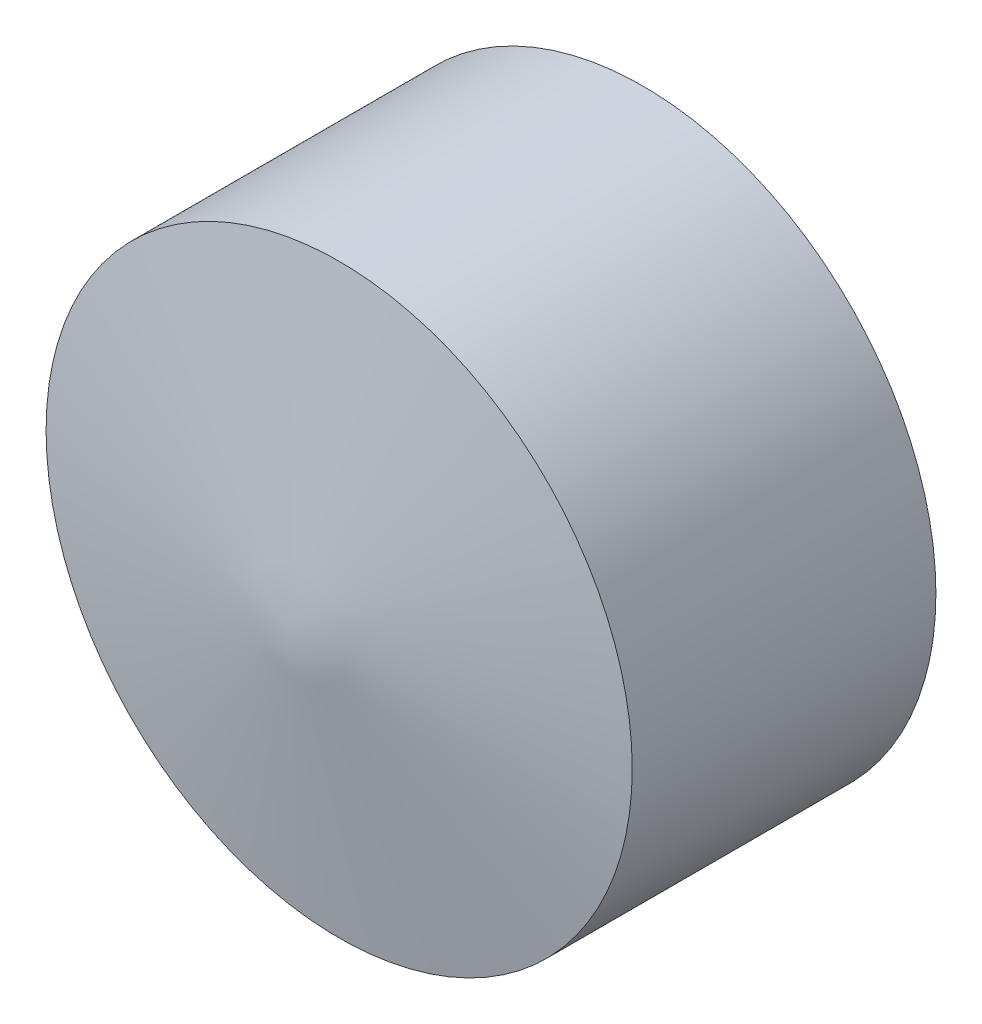
ISO-10303-21;
HEADER;
FILE_DESCRIPTION(('STEP AP214'),'2;1');
FILE_NAME('part.step','',(''),(''),'','','');
FILE_SCHEMA(('AUTOMOTIVE_DESIGN { 1 0 10303 214 1 1 1 1 }'));
ENDSEC;
DATA;
#1=APPLICATION_CONTEXT('core data for automotive mechanical design processes');
#2=APPLICATION_PROTOCOL_DEFINITION('international standard','automotive_design',2000,#1);
#3=PRODUCT_CONTEXT('',#1,'mechanical');
#4=PRODUCT('Part','Part','',(#3));
#5=PRODUCT_RELATED_PRODUCT_CATEGORY('part','',(#4));
#6=PRODUCT_DEFINITION_FORMATION('','',#4);
#7=PRODUCT_DEFINITION_CONTEXT('part definition',#1,'design');
#8=PRODUCT_DEFINITION('design','',#6,#7);
#9=PRODUCT_DEFINITION_SHAPE('','',#8);
#10=(LENGTH_UNIT() NAMED_UNIT(*) SI_UNIT(.MILLI.,.METRE.));
#11=(NAMED_UNIT(*) PLANE_ANGLE_UNIT() SI_UNIT($,.RADIAN.));
#12=(NAMED_UNIT(*) SI_UNIT($,.STERADIAN.) SOLID_ANGLE_UNIT());
#13=UNCERTAINTY_MEASURE_WITH_UNIT(LENGTH_MEASURE(1.E-05),#10,'distance_accuracy_value','');
#14=(GEOMETRIC_REPRESENTATION_CONTEXT(3) GLOBAL_UNCERTAINTY_ASSIGNED_CONTEXT((#13)) GLOBAL_UNIT_ASSIGNED_CONTEXT((#10,
#11,#12)) REPRESENTATION_CONTEXT('',''));
#15=CARTESIAN_POINT('',(0.,0.,0.));
#16=DIRECTION('',(0.,0.,1.));
#17=DIRECTION('',(1.,0.,0.));
#18=AXIS2_PLACEMENT_3D('',#15,#16,#17);
#19=CARTESIAN_POINT('',(476.510652388512,13.7304966360452,-227.105431195113));
#20=DIRECTION('',(0.,0.,1.));
#21=DIRECTION('',(1.,0.,0.));
#22=AXIS2_PLACEMENT_3D('',#19,#20,#21);
#23=PLANE('',#22);
#24=CARTESIAN_POINT('',(476.510652388512,32.9804966360452,-227.105431195113));
#25=DIRECTION('',(0.,0.,1.));
#26=DIRECTION('',(1.,0.,0.));
#27=AXIS2_PLACEMENT_3D('',#24,#25,#26);
#28=CIRCLE('',#27,38.5);
#29=CARTESIAN_POINT('',(515.010652388512,32.9804966360452,-227.105431195113));
#30=VERTEX_POINT('',#29);
#31=EDGE_CURVE('E20',#30,#30,#28,.F.);
#32=ORIENTED_EDGE('',*,*,#31,.T.);
#33=EDGE_LOOP('',(#32));
#34=FACE_BOUND('',#33,.T.);
#35=ADVANCED_FACE('F17',(#34),#23,.F.);
#36=CARTESIAN_POINT('',(476.510652388512,32.9804966360452,-247.105431195113));
#37=DIRECTION('',(0.,0.,1.));
#38=DIRECTION('',(1.,0.,0.));
#39=AXIS2_PLACEMENT_3D('',#36,#37,#38);
#40=CYLINDRICAL_SURFACE('',#39,38.5);
#41=CARTESIAN_POINT('',(476.510652388512,32.9804966360452,-267.105431195113));
#42=DIRECTION('',(0.,0.,1.));
#43=DIRECTION('',(1.,0.,0.));
#44=AXIS2_PLACEMENT_3D('',#41,#42,#43);
#45=CIRCLE('',#44,38.5);
#46=CARTESIAN_POINT('',(515.010652388512,32.9804966360452,-267.105431195113));
#47=VERTEX_POINT('',#46);
#48=EDGE_CURVE('E42',#47,#47,#45,.F.);
#49=ORIENTED_EDGE('',*,*,#48,.T.);
#50=EDGE_LOOP('',(#49));
#51=FACE_BOUND('',#50,.T.);
#52=ORIENTED_EDGE('',*,*,#31,.F.);
#53=EDGE_LOOP('',(#52));
#54=FACE_BOUND('',#53,.T.);
#55=ADVANCED_FACE('F51',(#51,#54),#40,.F.);
#56=CARTESIAN_POINT('',(476.510652388512,-7.01950336395481,-267.105431195113));
#57=DIRECTION('',(0.,0.,1.));
#58=DIRECTION('',(1.,0.,0.));
#59=AXIS2_PLACEMENT_3D('',#56,#57,#58);
#60=PLANE('',#59);
#61=CARTESIAN_POINT('',(476.510652388512,32.9804966360452,-267.105431195113));
#62=DIRECTION('',(0.,0.,-1.));
#63=DIRECTION('',(-1.,0.,0.));
#64=AXIS2_PLACEMENT_3D('',#61,#62,#63);
#65=CIRCLE('',#64,41.5);
#66=CARTESIAN_POINT('',(435.010652388512,32.9804966360452,-267.105431195113));
#67=VERTEX_POINT('',#66);
#68=EDGE_CURVE('E24',#67,#67,#65,.F.);
#69=ORIENTED_EDGE('',*,*,#68,.F.);
#70=EDGE_LOOP('',(#69));
#71=FACE_BOUND('',#70,.T.);
#72=ORIENTED_EDGE('',*,*,#48,.F.);
#73=EDGE_LOOP('',(#72));
#74=FACE_BOUND('',#73,.T.);
#75=ADVANCED_FACE('F32',(#71,#74),#60,.F.);
#76=CARTESIAN_POINT('',(476.510652388512,32.9804966360452,-224.105431195113));
#77=DIRECTION('',(0.,0.,-1.));
#78=DIRECTION('',(-1.,0.,0.));
#79=AXIS2_PLACEMENT_3D('',#76,#77,#78);
#80=CONICAL_SURFACE('',#79,41.5,1.40369452686379);
#81=CARTESIAN_POINT('',(476.510652388512,32.9804966360453,-217.105431195113));
#82=VERTEX_POINT('',#81);
#83=VERTEX_LOOP('',#82);
#84=FACE_BOUND('',#83,.T.);
#85=CARTESIAN_POINT('',(476.510652388512,32.9804966360452,-224.105431195113));
#86=DIRECTION('',(0.,0.,-1.));
#87=DIRECTION('',(-1.,0.,0.));
#88=AXIS2_PLACEMENT_3D('',#85,#86,#87);
#89=CIRCLE('',#88,41.5);
#90=CARTESIAN_POINT('',(435.010652388512,32.9804966360452,-224.105431195113));
#91=VERTEX_POINT('',#90);
#92=EDGE_CURVE('E11',#91,#91,#89,.T.);
#93=ORIENTED_EDGE('',*,*,#92,.F.);
#94=EDGE_LOOP('',(#93));
#95=FACE_BOUND('',#94,.T.);
#96=ADVANCED_FACE('F28',(#84,#95),#80,.T.);
#97=CARTESIAN_POINT('',(476.510652388512,32.9804966360452,-245.605431195113));
#98=DIRECTION('',(0.,0.,-1.));
#99=DIRECTION('',(-1.,0.,0.));
#100=AXIS2_PLACEMENT_3D('',#97,#98,#99);
#101=CYLINDRICAL_SURFACE('',#100,41.5);
#102=ORIENTED_EDGE('',*,*,#92,.T.);
#103=EDGE_LOOP('',(#102));
#104=FACE_BOUND('',#103,.T.);
#105=ORIENTED_EDGE('',*,*,#68,.T.);
#106=EDGE_LOOP('',(#105));
#107=FACE_BOUND('',#106,.T.);
#108=ADVANCED_FACE('F31',(#104,#107),#101,.T.);
#109=CLOSED_SHELL('',(#35,#55,#75,#96,#108));
#110=MANIFOLD_SOLID_BREP('B1',#109);
#111=ADVANCED_BREP_SHAPE_REPRESENTATION('',(#18,#110),#14);
#112=SHAPE_DEFINITION_REPRESENTATION(#9,#111);
ENDSEC;
END-ISO-10303-21;
